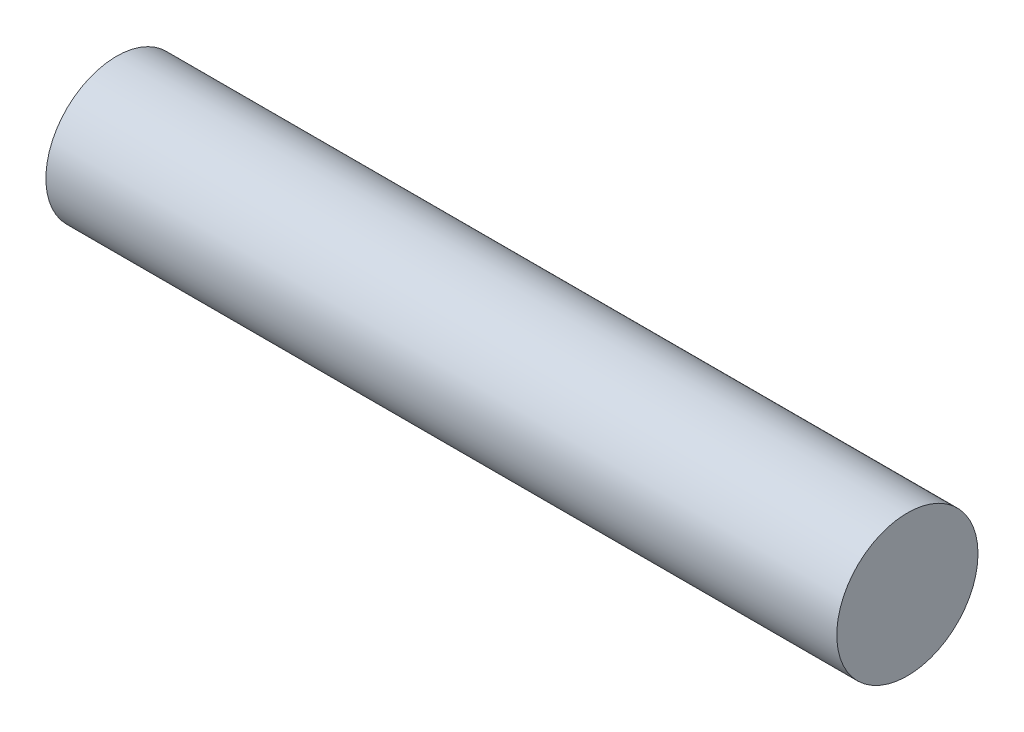
ISO-10303-21;
HEADER;
FILE_DESCRIPTION(('STEP AP214'),'2;1');
FILE_NAME('part.step','',(''),(''),'','','');
FILE_SCHEMA(('AUTOMOTIVE_DESIGN { 1 0 10303 214 1 1 1 1 }'));
ENDSEC;
DATA;
#1=APPLICATION_CONTEXT('core data for automotive mechanical design processes');
#2=APPLICATION_PROTOCOL_DEFINITION('international standard','automotive_design',2000,#1);
#3=PRODUCT_CONTEXT('',#1,'mechanical');
#4=PRODUCT('Part','Part','',(#3));
#5=PRODUCT_RELATED_PRODUCT_CATEGORY('part','',(#4));
#6=PRODUCT_DEFINITION_FORMATION('','',#4);
#7=PRODUCT_DEFINITION_CONTEXT('part definition',#1,'design');
#8=PRODUCT_DEFINITION('design','',#6,#7);
#9=PRODUCT_DEFINITION_SHAPE('','',#8);
#10=(LENGTH_UNIT() NAMED_UNIT(*) SI_UNIT(.MILLI.,.METRE.));
#11=(NAMED_UNIT(*) PLANE_ANGLE_UNIT() SI_UNIT($,.RADIAN.));
#12=(NAMED_UNIT(*) SI_UNIT($,.STERADIAN.) SOLID_ANGLE_UNIT());
#13=UNCERTAINTY_MEASURE_WITH_UNIT(LENGTH_MEASURE(1.E-05),#10,'distance_accuracy_value','');
#14=(GEOMETRIC_REPRESENTATION_CONTEXT(3) GLOBAL_UNCERTAINTY_ASSIGNED_CONTEXT((#13)) GLOBAL_UNIT_ASSIGNED_CONTEXT((#10,
#11,#12)) REPRESENTATION_CONTEXT('',''));
#15=CARTESIAN_POINT('',(0.,0.,0.));
#16=DIRECTION('',(0.,0.,1.));
#17=DIRECTION('',(1.,0.,0.));
#18=AXIS2_PLACEMENT_3D('',#15,#16,#17);
#19=CARTESIAN_POINT('',(-15.24,0.,0.));
#20=DIRECTION('',(1.,0.,0.));
#21=DIRECTION('',(0.,0.,-1.));
#22=AXIS2_PLACEMENT_3D('',#19,#20,#21);
#23=CYLINDRICAL_SURFACE('',#22,3.175);
#24=CARTESIAN_POINT('',(-15.24,0.,0.));
#25=DIRECTION('',(1.,0.,0.));
#26=DIRECTION('',(0.,0.,-1.));
#27=AXIS2_PLACEMENT_3D('',#24,#25,#26);
#28=CIRCLE('',#27,3.175);
#29=CARTESIAN_POINT('',(-15.24,0.,-3.175));
#30=VERTEX_POINT('',#29);
#31=EDGE_CURVE('E10',#30,#30,#28,.T.);
#32=CARTESIAN_POINT('',(20.32,0.,0.));
#33=DIRECTION('',(1.,0.,0.));
#34=DIRECTION('',(0.,0.,-1.));
#35=AXIS2_PLACEMENT_3D('',#32,#33,#34);
#36=CIRCLE('',#35,3.175);
#37=CARTESIAN_POINT('',(20.32,0.,-3.175));
#38=VERTEX_POINT('',#37);
#39=EDGE_CURVE('E36',#38,#38,#36,.T.);
#40=CARTESIAN_POINT('',(-15.24,0.,-3.175));
#41=CARTESIAN_POINT('',(-14.8695833333333,0.,-3.175));
#42=CARTESIAN_POINT('',(-14.4991666666667,0.,-3.175));
#43=CARTESIAN_POINT('',(-13.7583333333333,0.,-3.175));
#44=CARTESIAN_POINT('',(-13.3879166666667,0.,-3.175));
#45=CARTESIAN_POINT('',(-12.6470833333333,0.,-3.175));
#46=CARTESIAN_POINT('',(-12.2766666666667,0.,-3.175));
#47=CARTESIAN_POINT('',(-11.5358333333333,0.,-3.175));
#48=CARTESIAN_POINT('',(-11.1654166666667,0.,-3.175));
#49=CARTESIAN_POINT('',(-10.4245833333333,0.,-3.175));
#50=CARTESIAN_POINT('',(-10.0541666666667,0.,-3.175));
#51=CARTESIAN_POINT('',(-9.31333333333333,0.,-3.175));
#52=CARTESIAN_POINT('',(-8.94291666666667,0.,-3.175));
#53=CARTESIAN_POINT('',(-8.20208333333333,0.,-3.175));
#54=CARTESIAN_POINT('',(-7.83166666666667,0.,-3.175));
#55=CARTESIAN_POINT('',(-7.09083333333334,0.,-3.175));
#56=CARTESIAN_POINT('',(-6.72041666666667,0.,-3.175));
#57=CARTESIAN_POINT('',(-5.97958333333334,0.,-3.175));
#58=CARTESIAN_POINT('',(-5.60916666666667,0.,-3.175));
#59=CARTESIAN_POINT('',(-4.86833333333334,0.,-3.175));
#60=CARTESIAN_POINT('',(-4.49791666666667,0.,-3.175));
#61=CARTESIAN_POINT('',(-3.75708333333334,0.,-3.175));
#62=CARTESIAN_POINT('',(-3.38666666666667,0.,-3.175));
#63=CARTESIAN_POINT('',(-2.64583333333334,0.,-3.175));
#64=CARTESIAN_POINT('',(-2.27541666666667,0.,-3.175));
#65=CARTESIAN_POINT('',(-1.53458333333334,0.,-3.175));
#66=CARTESIAN_POINT('',(-1.16416666666667,0.,-3.175));
#67=CARTESIAN_POINT('',(-0.423333333333337,0.,-3.175));
#68=CARTESIAN_POINT('',(-0.0529166666666705,0.,-3.175));
#69=CARTESIAN_POINT('',(0.687916666666662,0.,-3.175));
#70=CARTESIAN_POINT('',(1.05833333333333,0.,-3.175));
#71=CARTESIAN_POINT('',(1.79916666666666,0.,-3.175));
#72=CARTESIAN_POINT('',(2.16958333333333,0.,-3.175));
#73=CARTESIAN_POINT('',(2.91041666666666,0.,-3.175));
#74=CARTESIAN_POINT('',(3.28083333333333,0.,-3.175));
#75=CARTESIAN_POINT('',(4.02166666666666,0.,-3.175));
#76=CARTESIAN_POINT('',(4.39208333333333,0.,-3.175));
#77=CARTESIAN_POINT('',(5.13291666666666,0.,-3.175));
#78=CARTESIAN_POINT('',(5.50333333333333,0.,-3.175));
#79=CARTESIAN_POINT('',(6.24416666666666,0.,-3.175));
#80=CARTESIAN_POINT('',(6.61458333333333,0.,-3.175));
#81=CARTESIAN_POINT('',(7.35541666666666,0.,-3.175));
#82=CARTESIAN_POINT('',(7.72583333333333,0.,-3.175));
#83=CARTESIAN_POINT('',(8.46666666666666,0.,-3.175));
#84=CARTESIAN_POINT('',(8.83708333333333,0.,-3.175));
#85=CARTESIAN_POINT('',(9.57791666666666,0.,-3.175));
#86=CARTESIAN_POINT('',(9.94833333333333,0.,-3.175));
#87=CARTESIAN_POINT('',(10.6891666666667,0.,-3.175));
#88=CARTESIAN_POINT('',(11.0595833333333,0.,-3.175));
#89=CARTESIAN_POINT('',(11.8004166666667,0.,-3.175));
#90=CARTESIAN_POINT('',(12.1708333333333,0.,-3.175));
#91=CARTESIAN_POINT('',(12.9116666666667,0.,-3.175));
#92=CARTESIAN_POINT('',(13.2820833333333,0.,-3.175));
#93=CARTESIAN_POINT('',(14.0229166666667,0.,-3.175));
#94=CARTESIAN_POINT('',(14.3933333333333,0.,-3.175));
#95=CARTESIAN_POINT('',(15.1341666666667,0.,-3.175));
#96=CARTESIAN_POINT('',(15.5045833333333,0.,-3.175));
#97=CARTESIAN_POINT('',(16.2454166666667,0.,-3.175));
#98=CARTESIAN_POINT('',(16.6158333333333,0.,-3.175));
#99=CARTESIAN_POINT('',(17.3566666666667,0.,-3.175));
#100=CARTESIAN_POINT('',(17.7270833333333,0.,-3.175));
#101=CARTESIAN_POINT('',(18.4679166666667,0.,-3.175));
#102=CARTESIAN_POINT('',(18.8383333333333,0.,-3.175));
#103=CARTESIAN_POINT('',(19.5791666666667,0.,-3.175));
#104=CARTESIAN_POINT('',(19.9495833333333,0.,-3.175));
#105=CARTESIAN_POINT('',(20.32,0.,-3.175));
#106=B_SPLINE_CURVE_WITH_KNOTS('',3,(#40,#41,#42,#43,#44,#45,#46,#47,#48,#49,#50,#51,#52,#53,
#54,#55,#56,#57,#58,#59,#60,#61,#62,#63,#64,#65,#66,#67,#68,#69,#70,#71,#72,#73,#74,#75,#76,#77,
#78,#79,#80,#81,#82,#83,#84,#85,#86,#87,#88,#89,#90,#91,#92,#93,#94,#95,#96,#97,#98,#99,#100,
#101,#102,#103,#104,#105),.UNSPECIFIED.,.F.,.F.,(4,2,2,2,2,2,2,2,2,2,2,2,2,2,2,2,2,2,2,2,2,2,2,
2,2,2,2,2,2,2,2,2,4),(0.,1.11125,2.2225,3.33375,4.445,5.55625,6.6675,7.77875,8.89,10.00125,
11.1125,12.22375,13.335,14.44625,15.5575,16.66875,17.78,18.89125,20.0025,21.11375,22.225,
23.33625,24.4475,25.55875,26.67,27.78125,28.8925,30.00375,31.115,32.22625,33.3375,34.44875,
35.56),.UNSPECIFIED.);
#107=EDGE_CURVE('BSEAM30',#30,#38,#106,.T.);
#108=ORIENTED_EDGE('',*,*,#31,.T.);
#109=ORIENTED_EDGE('',*,*,#39,.F.);
#110=ORIENTED_EDGE('',*,*,#107,.T.);
#111=ORIENTED_EDGE('',*,*,#107,.F.);
#112=EDGE_LOOP('',(#108,#110,#109,#111));
#113=FACE_BOUND('',#112,.T.);
#114=ADVANCED_FACE('F30',(#113),#23,.T.);
#115=CARTESIAN_POINT('',(-15.24,0.,0.));
#116=DIRECTION('',(1.,0.,0.));
#117=DIRECTION('',(0.,0.,-1.));
#118=AXIS2_PLACEMENT_3D('',#115,#116,#117);
#119=PLANE('',#118);
#120=ORIENTED_EDGE('',*,*,#31,.F.);
#121=EDGE_LOOP('',(#120));
#122=FACE_BOUND('',#121,.T.);
#123=ADVANCED_FACE('F45',(#122),#119,.F.);
#124=CARTESIAN_POINT('',(20.32,0.,0.));
#125=DIRECTION('',(1.,0.,0.));
#126=DIRECTION('',(0.,0.,-1.));
#127=AXIS2_PLACEMENT_3D('',#124,#125,#126);
#128=PLANE('',#127);
#129=ORIENTED_EDGE('',*,*,#39,.T.);
#130=EDGE_LOOP('',(#129));
#131=FACE_BOUND('',#130,.T.);
#132=ADVANCED_FACE('F42',(#131),#128,.T.);
#133=CLOSED_SHELL('',(#114,#123,#132));
#134=MANIFOLD_SOLID_BREP('B2',#133);
#135=ADVANCED_BREP_SHAPE_REPRESENTATION('',(#18,#134),#14);
#136=SHAPE_DEFINITION_REPRESENTATION(#9,#135);
ENDSEC;
END-ISO-10303-21;
